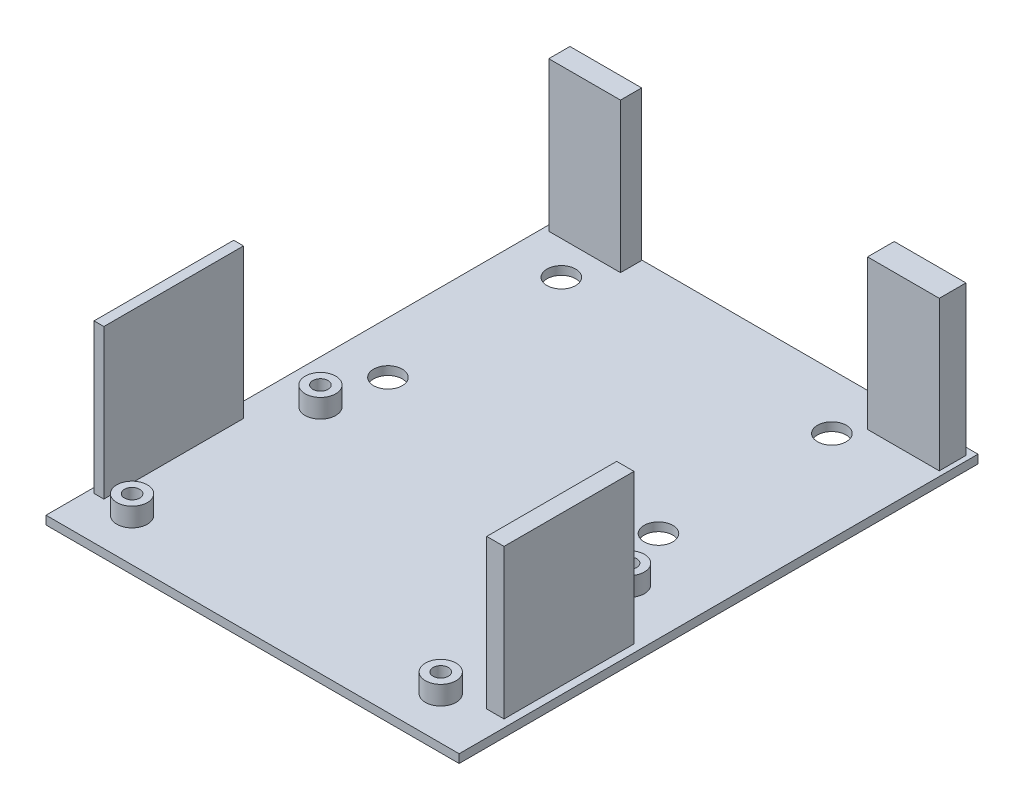
ISO-10303-21;
HEADER;
FILE_DESCRIPTION(('STEP AP214'),'2;1');
FILE_NAME('part.step','',(''),(''),'','','');
FILE_SCHEMA(('AUTOMOTIVE_DESIGN { 1 0 10303 214 1 1 1 1 }'));
ENDSEC;
DATA;
#1=APPLICATION_CONTEXT('core data for automotive mechanical design processes');
#2=APPLICATION_PROTOCOL_DEFINITION('international standard','automotive_design',2000,#1);
#3=PRODUCT_CONTEXT('',#1,'mechanical');
#4=PRODUCT('Part','Part','',(#3));
#5=PRODUCT_RELATED_PRODUCT_CATEGORY('part','',(#4));
#6=PRODUCT_DEFINITION_FORMATION('','',#4);
#7=PRODUCT_DEFINITION_CONTEXT('part definition',#1,'design');
#8=PRODUCT_DEFINITION('design','',#6,#7);
#9=PRODUCT_DEFINITION_SHAPE('','',#8);
#10=(LENGTH_UNIT() NAMED_UNIT(*) SI_UNIT(.MILLI.,.METRE.));
#11=(NAMED_UNIT(*) PLANE_ANGLE_UNIT() SI_UNIT($,.RADIAN.));
#12=(NAMED_UNIT(*) SI_UNIT($,.STERADIAN.) SOLID_ANGLE_UNIT());
#13=UNCERTAINTY_MEASURE_WITH_UNIT(LENGTH_MEASURE(1.E-05),#10,'distance_accuracy_value','');
#14=(GEOMETRIC_REPRESENTATION_CONTEXT(3) GLOBAL_UNCERTAINTY_ASSIGNED_CONTEXT((#13)) GLOBAL_UNIT_ASSIGNED_CONTEXT((#10,
#11,#12)) REPRESENTATION_CONTEXT('',''));
#15=CARTESIAN_POINT('',(0.,0.,0.));
#16=DIRECTION('',(0.,0.,1.));
#17=DIRECTION('',(1.,0.,0.));
#18=AXIS2_PLACEMENT_3D('',#15,#16,#17);
#19=CARTESIAN_POINT('',(40.9585387212004,1.778,0.));
#20=DIRECTION('',(1.,0.,0.));
#21=DIRECTION('',(0.,0.,-1.));
#22=AXIS2_PLACEMENT_3D('',#19,#20,#21);
#23=PLANE('',#22);
#24=DIRECTION('',(0.,0.,1.));
#25=VECTOR('',#24,1.);
#26=CARTESIAN_POINT('',(40.9585387212004,0.,0.));
#27=LINE('',#26,#25);
#28=CARTESIAN_POINT('',(40.9585387212004,0.,-82.3503703778729));
#29=VERTEX_POINT('',#28);
#30=CARTESIAN_POINT('',(40.9585387212004,0.,26.1076296221271));
#31=VERTEX_POINT('',#30);
#32=EDGE_CURVE('E425',#29,#31,#27,.T.);
#33=ORIENTED_EDGE('',*,*,#32,.F.);
#34=DIRECTION('',(0.,-1.,0.));
#35=VECTOR('',#34,1.);
#36=CARTESIAN_POINT('',(40.9585387212004,1.778,-82.3503703778729));
#37=LINE('',#36,#35);
#38=CARTESIAN_POINT('',(40.9585387212004,1.778,-82.3503703778729));
#39=VERTEX_POINT('',#38);
#40=EDGE_CURVE('E11',#39,#29,#37,.T.);
#41=ORIENTED_EDGE('',*,*,#40,.F.);
#42=DIRECTION('',(0.,0.,1.));
#43=VECTOR('',#42,1.);
#44=CARTESIAN_POINT('',(40.9585387212004,1.778,0.));
#45=LINE('',#44,#43);
#46=CARTESIAN_POINT('',(40.9585387212004,1.778,26.1076296221271));
#47=VERTEX_POINT('',#46);
#48=EDGE_CURVE('E348',#39,#47,#45,.T.);
#49=ORIENTED_EDGE('',*,*,#48,.T.);
#50=DIRECTION('',(0.,-1.,0.));
#51=VECTOR('',#50,1.);
#52=CARTESIAN_POINT('',(40.9585387212004,1.778,26.1076296221271));
#53=LINE('',#52,#51);
#54=EDGE_CURVE('E90',#47,#31,#53,.T.);
#55=ORIENTED_EDGE('',*,*,#54,.T.);
#56=EDGE_LOOP('',(#33,#41,#49,#55));
#57=FACE_BOUND('',#56,.T.);
#58=ADVANCED_FACE('F47',(#57),#23,.T.);
#59=CARTESIAN_POINT('',(0.,1.778,-82.3503703778729));
#60=DIRECTION('',(0.,0.,-1.));
#61=DIRECTION('',(-1.,0.,0.));
#62=AXIS2_PLACEMENT_3D('',#59,#60,#61);
#63=PLANE('',#62);
#64=DIRECTION('',(1.,0.,0.));
#65=VECTOR('',#64,1.);
#66=CARTESIAN_POINT('',(0.,0.,-82.3503703778729));
#67=LINE('',#66,#65);
#68=CARTESIAN_POINT('',(-45.4014612787996,0.,-82.3503703778729));
#69=VERTEX_POINT('',#68);
#70=EDGE_CURVE('E428',#69,#29,#67,.T.);
#71=ORIENTED_EDGE('',*,*,#70,.F.);
#72=DIRECTION('',(0.,-1.,0.));
#73=VECTOR('',#72,1.);
#74=CARTESIAN_POINT('',(-45.4014612787996,1.778,-82.3503703778729));
#75=LINE('',#74,#73);
#76=CARTESIAN_POINT('',(-45.4014612787996,1.778,-82.3503703778729));
#77=VERTEX_POINT('',#76);
#78=EDGE_CURVE('E57',#77,#69,#75,.T.);
#79=ORIENTED_EDGE('',*,*,#78,.F.);
#80=DIRECTION('',(1.,0.,0.));
#81=VECTOR('',#80,1.);
#82=CARTESIAN_POINT('',(0.,1.778,-82.3503703778729));
#83=LINE('',#82,#81);
#84=EDGE_CURVE('E351',#77,#39,#83,.T.);
#85=ORIENTED_EDGE('',*,*,#84,.T.);
#86=ORIENTED_EDGE('',*,*,#40,.T.);
#87=EDGE_LOOP('',(#71,#79,#85,#86));
#88=FACE_BOUND('',#87,.T.);
#89=ADVANCED_FACE('F452',(#88),#63,.T.);
#90=CARTESIAN_POINT('',(-45.4014612787996,1.778,0.));
#91=DIRECTION('',(1.,0.,0.));
#92=DIRECTION('',(0.,0.,-1.));
#93=AXIS2_PLACEMENT_3D('',#90,#91,#92);
#94=PLANE('',#93);
#95=DIRECTION('',(0.,0.,1.));
#96=VECTOR('',#95,1.);
#97=CARTESIAN_POINT('',(-45.4014612787996,0.,0.));
#98=LINE('',#97,#96);
#99=CARTESIAN_POINT('',(-45.4014612787996,0.,26.1076296221271));
#100=VERTEX_POINT('',#99);
#101=EDGE_CURVE('E432',#69,#100,#98,.T.);
#102=ORIENTED_EDGE('',*,*,#101,.T.);
#103=DIRECTION('',(0.,-1.,0.));
#104=VECTOR('',#103,1.);
#105=CARTESIAN_POINT('',(-45.4014612787996,1.778,26.1076296221271));
#106=LINE('',#105,#104);
#107=CARTESIAN_POINT('',(-45.4014612787996,1.778,26.1076296221271));
#108=VERTEX_POINT('',#107);
#109=EDGE_CURVE('E440',#108,#100,#106,.T.);
#110=ORIENTED_EDGE('',*,*,#109,.F.);
#111=DIRECTION('',(0.,0.,1.));
#112=VECTOR('',#111,1.);
#113=CARTESIAN_POINT('',(-45.4014612787996,1.778,0.));
#114=LINE('',#113,#112);
#115=EDGE_CURVE('E355',#77,#108,#114,.T.);
#116=ORIENTED_EDGE('',*,*,#115,.F.);
#117=ORIENTED_EDGE('',*,*,#78,.T.);
#118=EDGE_LOOP('',(#102,#110,#116,#117));
#119=FACE_BOUND('',#118,.T.);
#120=ADVANCED_FACE('F445',(#119),#94,.F.);
#121=CARTESIAN_POINT('',(0.,1.778,26.1076296221271));
#122=DIRECTION('',(0.,0.,-1.));
#123=DIRECTION('',(-1.,0.,0.));
#124=AXIS2_PLACEMENT_3D('',#121,#122,#123);
#125=PLANE('',#124);
#126=DIRECTION('',(1.,0.,0.));
#127=VECTOR('',#126,1.);
#128=CARTESIAN_POINT('',(0.,0.,26.1076296221271));
#129=LINE('',#128,#127);
#130=EDGE_CURVE('E82',#100,#31,#129,.T.);
#131=ORIENTED_EDGE('',*,*,#130,.T.);
#132=ORIENTED_EDGE('',*,*,#54,.F.);
#133=DIRECTION('',(1.,0.,0.));
#134=VECTOR('',#133,1.);
#135=CARTESIAN_POINT('',(0.,1.778,26.1076296221271));
#136=LINE('',#135,#134);
#137=EDGE_CURVE('E359',#108,#47,#136,.T.);
#138=ORIENTED_EDGE('',*,*,#137,.F.);
#139=ORIENTED_EDGE('',*,*,#109,.T.);
#140=EDGE_LOOP('',(#131,#132,#138,#139));
#141=FACE_BOUND('',#140,.T.);
#142=ADVANCED_FACE('F465',(#141),#125,.F.);
#143=CARTESIAN_POINT('',(-34.6100551644093,1.778,-70.8225192664491));
#144=DIRECTION('',(0.,-1.,0.));
#145=DIRECTION('',(0.,0.,-1.));
#146=AXIS2_PLACEMENT_3D('',#143,#144,#145);
#147=CYLINDRICAL_SURFACE('',#146,3.);
#148=CARTESIAN_POINT('',(-34.6100551644093,1.778,-70.8225192664491));
#149=DIRECTION('',(0.,1.,0.));
#150=DIRECTION('',(0.,0.,1.));
#151=AXIS2_PLACEMENT_3D('',#148,#149,#150);
#152=CIRCLE('',#151,3.);
#153=CARTESIAN_POINT('',(-34.6100551644093,1.778,-67.822519266449));
#154=VERTEX_POINT('',#153);
#155=EDGE_CURVE('E344',#154,#154,#152,.T.);
#156=ORIENTED_EDGE('',*,*,#155,.T.);
#157=EDGE_LOOP('',(#156));
#158=FACE_BOUND('',#157,.T.);
#159=CARTESIAN_POINT('',(-34.6100551644093,0.,-70.8225192664491));
#160=DIRECTION('',(0.,1.,0.));
#161=DIRECTION('',(0.,0.,1.));
#162=AXIS2_PLACEMENT_3D('',#159,#160,#161);
#163=CIRCLE('',#162,3.);
#164=CARTESIAN_POINT('',(-34.6100551644093,0.,-67.822519266449));
#165=VERTEX_POINT('',#164);
#166=EDGE_CURVE('E421',#165,#165,#163,.T.);
#167=ORIENTED_EDGE('',*,*,#166,.F.);
#168=EDGE_LOOP('',(#167));
#169=FACE_BOUND('',#168,.T.);
#170=ADVANCED_FACE('F461',(#158,#169),#147,.F.);
#171=CARTESIAN_POINT('',(21.9430448355907,1.778,-70.8225192664491));
#172=DIRECTION('',(0.,-1.,0.));
#173=DIRECTION('',(0.,0.,-1.));
#174=AXIS2_PLACEMENT_3D('',#171,#172,#173);
#175=CYLINDRICAL_SURFACE('',#174,3.);
#176=CARTESIAN_POINT('',(21.9430448355907,1.778,-70.8225192664491));
#177=DIRECTION('',(0.,1.,0.));
#178=DIRECTION('',(0.,0.,1.));
#179=AXIS2_PLACEMENT_3D('',#176,#177,#178);
#180=CIRCLE('',#179,3.);
#181=CARTESIAN_POINT('',(21.9430448355907,1.778,-67.822519266449));
#182=VERTEX_POINT('',#181);
#183=EDGE_CURVE('E340',#182,#182,#180,.T.);
#184=ORIENTED_EDGE('',*,*,#183,.T.);
#185=EDGE_LOOP('',(#184));
#186=FACE_BOUND('',#185,.T.);
#187=CARTESIAN_POINT('',(21.9430448355907,0.,-70.8225192664491));
#188=DIRECTION('',(0.,1.,0.));
#189=DIRECTION('',(0.,0.,1.));
#190=AXIS2_PLACEMENT_3D('',#187,#188,#189);
#191=CIRCLE('',#190,3.);
#192=CARTESIAN_POINT('',(21.9430448355907,0.,-67.822519266449));
#193=VERTEX_POINT('',#192);
#194=EDGE_CURVE('E417',#193,#193,#191,.T.);
#195=ORIENTED_EDGE('',*,*,#194,.F.);
#196=EDGE_LOOP('',(#195));
#197=FACE_BOUND('',#196,.T.);
#198=ADVANCED_FACE('F464',(#186,#197),#175,.F.);
#199=CARTESIAN_POINT('',(-34.6100551644093,1.778,-34.5767192664491));
#200=DIRECTION('',(0.,-1.,0.));
#201=DIRECTION('',(0.,0.,-1.));
#202=AXIS2_PLACEMENT_3D('',#199,#200,#201);
#203=CYLINDRICAL_SURFACE('',#202,3.);
#204=CARTESIAN_POINT('',(-34.6100551644093,1.778,-34.5767192664491));
#205=DIRECTION('',(0.,1.,0.));
#206=DIRECTION('',(0.,0.,1.));
#207=AXIS2_PLACEMENT_3D('',#204,#205,#206);
#208=CIRCLE('',#207,3.);
#209=CARTESIAN_POINT('',(-34.6100551644093,1.778,-31.5767192664491));
#210=VERTEX_POINT('',#209);
#211=EDGE_CURVE('E336',#210,#210,#208,.T.);
#212=ORIENTED_EDGE('',*,*,#211,.T.);
#213=EDGE_LOOP('',(#212));
#214=FACE_BOUND('',#213,.T.);
#215=CARTESIAN_POINT('',(-34.6100551644093,0.,-34.5767192664491));
#216=DIRECTION('',(0.,1.,0.));
#217=DIRECTION('',(0.,0.,1.));
#218=AXIS2_PLACEMENT_3D('',#215,#216,#217);
#219=CIRCLE('',#218,3.);
#220=CARTESIAN_POINT('',(-34.6100551644093,0.,-31.5767192664491));
#221=VERTEX_POINT('',#220);
#222=EDGE_CURVE('E413',#221,#221,#219,.T.);
#223=ORIENTED_EDGE('',*,*,#222,.F.);
#224=EDGE_LOOP('',(#223));
#225=FACE_BOUND('',#224,.T.);
#226=ADVANCED_FACE('F468',(#214,#225),#203,.F.);
#227=CARTESIAN_POINT('',(21.9430448355907,1.778,-34.5767192664491));
#228=DIRECTION('',(0.,-1.,0.));
#229=DIRECTION('',(0.,0.,-1.));
#230=AXIS2_PLACEMENT_3D('',#227,#228,#229);
#231=CYLINDRICAL_SURFACE('',#230,3.);
#232=CARTESIAN_POINT('',(21.9430448355907,1.778,-34.5767192664491));
#233=DIRECTION('',(0.,1.,0.));
#234=DIRECTION('',(0.,0.,1.));
#235=AXIS2_PLACEMENT_3D('',#232,#233,#234);
#236=CIRCLE('',#235,3.);
#237=CARTESIAN_POINT('',(21.9430448355907,1.778,-31.5767192664491));
#238=VERTEX_POINT('',#237);
#239=EDGE_CURVE('E332',#238,#238,#236,.T.);
#240=ORIENTED_EDGE('',*,*,#239,.T.);
#241=EDGE_LOOP('',(#240));
#242=FACE_BOUND('',#241,.T.);
#243=CARTESIAN_POINT('',(21.9430448355907,0.,-34.5767192664491));
#244=DIRECTION('',(0.,1.,0.));
#245=DIRECTION('',(0.,0.,1.));
#246=AXIS2_PLACEMENT_3D('',#243,#244,#245);
#247=CIRCLE('',#246,3.);
#248=CARTESIAN_POINT('',(21.9430448355907,0.,-31.5767192664491));
#249=VERTEX_POINT('',#248);
#250=EDGE_CURVE('E312',#249,#249,#247,.T.);
#251=ORIENTED_EDGE('',*,*,#250,.F.);
#252=EDGE_LOOP('',(#251));
#253=FACE_BOUND('',#252,.T.);
#254=ADVANCED_FACE('F49',(#242,#253),#231,.F.);
#255=CARTESIAN_POINT('',(0.,1.778,0.));
#256=DIRECTION('',(0.,1.,0.));
#257=DIRECTION('',(0.,0.,1.));
#258=AXIS2_PLACEMENT_3D('',#255,#256,#257);
#259=PLANE('',#258);
#260=CARTESIAN_POINT('',(28.1534381304671,1.778,17.1504808356986));
#261=DIRECTION('',(0.,1.,0.));
#262=DIRECTION('',(0.,0.,1.));
#263=AXIS2_PLACEMENT_3D('',#260,#261,#262);
#264=CIRCLE('',#263,3.2);
#265=CARTESIAN_POINT('',(28.1534381304671,1.778,20.3504808356986));
#266=VERTEX_POINT('',#265);
#267=EDGE_CURVE('E316',#266,#266,#264,.T.);
#268=ORIENTED_EDGE('',*,*,#267,.F.);
#269=EDGE_LOOP('',(#268));
#270=FACE_BOUND('',#269,.T.);
#271=CARTESIAN_POINT('',(-36.3625618695329,1.778,17.1504808356986));
#272=DIRECTION('',(0.,1.,0.));
#273=DIRECTION('',(0.,0.,1.));
#274=AXIS2_PLACEMENT_3D('',#271,#272,#273);
#275=CIRCLE('',#274,3.2);
#276=CARTESIAN_POINT('',(-36.3625618695329,1.778,20.3504808356986));
#277=VERTEX_POINT('',#276);
#278=EDGE_CURVE('E320',#277,#277,#275,.T.);
#279=ORIENTED_EDGE('',*,*,#278,.F.);
#280=EDGE_LOOP('',(#279));
#281=FACE_BOUND('',#280,.T.);
#282=CARTESIAN_POINT('',(28.1534381304671,1.778,-22.2195191643014));
#283=DIRECTION('',(0.,1.,0.));
#284=DIRECTION('',(0.,0.,1.));
#285=AXIS2_PLACEMENT_3D('',#282,#283,#284);
#286=CIRCLE('',#285,3.2);
#287=CARTESIAN_POINT('',(28.1534381304671,1.778,-19.0195191643014));
#288=VERTEX_POINT('',#287);
#289=EDGE_CURVE('E324',#288,#288,#286,.T.);
#290=ORIENTED_EDGE('',*,*,#289,.F.);
#291=EDGE_LOOP('',(#290));
#292=FACE_BOUND('',#291,.T.);
#293=CARTESIAN_POINT('',(-36.3625618695329,1.778,-22.2195191643014));
#294=DIRECTION('',(0.,1.,0.));
#295=DIRECTION('',(0.,0.,1.));
#296=AXIS2_PLACEMENT_3D('',#293,#294,#295);
#297=CIRCLE('',#296,3.2);
#298=CARTESIAN_POINT('',(-36.3625618695329,1.778,-19.0195191643014));
#299=VERTEX_POINT('',#298);
#300=EDGE_CURVE('E328',#299,#299,#297,.T.);
#301=ORIENTED_EDGE('',*,*,#300,.F.);
#302=EDGE_LOOP('',(#301));
#303=FACE_BOUND('',#302,.T.);
#304=ORIENTED_EDGE('',*,*,#239,.F.);
#305=EDGE_LOOP('',(#304));
#306=FACE_BOUND('',#305,.T.);
#307=ORIENTED_EDGE('',*,*,#211,.F.);
#308=EDGE_LOOP('',(#307));
#309=FACE_BOUND('',#308,.T.);
#310=ORIENTED_EDGE('',*,*,#183,.F.);
#311=EDGE_LOOP('',(#310));
#312=FACE_BOUND('',#311,.T.);
#313=ORIENTED_EDGE('',*,*,#155,.F.);
#314=EDGE_LOOP('',(#313));
#315=FACE_BOUND('',#314,.T.);
#316=ORIENTED_EDGE('',*,*,#48,.F.);
#317=ORIENTED_EDGE('',*,*,#84,.F.);
#318=ORIENTED_EDGE('',*,*,#115,.T.);
#319=ORIENTED_EDGE('',*,*,#137,.T.);
#320=EDGE_LOOP('',(#316,#317,#318,#319));
#321=FACE_BOUND('',#320,.T.);
#322=DIRECTION('',(1.,0.,0.));
#323=VECTOR('',#322,1.);
#324=CARTESIAN_POINT('',(0.,1.778,-82.2619916514084));
#325=LINE('',#324,#323);
#326=CARTESIAN_POINT('',(-44.2528565853673,1.778,-82.2619916514084));
#327=VERTEX_POINT('',#326);
#328=CARTESIAN_POINT('',(-29.2592550624016,1.778,-82.2619916514084));
#329=VERTEX_POINT('',#328);
#330=EDGE_CURVE('E362',#327,#329,#325,.T.);
#331=ORIENTED_EDGE('',*,*,#330,.T.);
#332=DIRECTION('',(0.,0.,1.));
#333=VECTOR('',#332,1.);
#334=CARTESIAN_POINT('',(-29.2592550624016,1.778,0.));
#335=LINE('',#334,#333);
#336=CARTESIAN_POINT('',(-29.2592550624016,1.778,-77.8401570510367));
#337=VERTEX_POINT('',#336);
#338=EDGE_CURVE('E365',#329,#337,#335,.T.);
#339=ORIENTED_EDGE('',*,*,#338,.T.);
#340=DIRECTION('',(1.,0.,0.));
#341=VECTOR('',#340,1.);
#342=CARTESIAN_POINT('',(0.,1.778,-77.8401570510367));
#343=LINE('',#342,#341);
#344=CARTESIAN_POINT('',(-44.2528565853673,1.778,-77.8401570510367));
#345=VERTEX_POINT('',#344);
#346=EDGE_CURVE('E369',#345,#337,#343,.T.);
#347=ORIENTED_EDGE('',*,*,#346,.F.);
#348=DIRECTION('',(0.,0.,1.));
#349=VECTOR('',#348,1.);
#350=CARTESIAN_POINT('',(-44.2528565853673,1.778,0.));
#351=LINE('',#350,#349);
#352=EDGE_CURVE('E373',#327,#345,#351,.T.);
#353=ORIENTED_EDGE('',*,*,#352,.F.);
#354=EDGE_LOOP('',(#331,#339,#347,#353));
#355=FACE_BOUND('',#354,.T.);
#356=DIRECTION('',(1.,0.,0.));
#357=VECTOR('',#356,1.);
#358=CARTESIAN_POINT('',(0.,1.778,-80.8514753160351));
#359=LINE('',#358,#357);
#360=CARTESIAN_POINT('',(24.9444737075684,1.778,-80.8514753160351));
#361=VERTEX_POINT('',#360);
#362=CARTESIAN_POINT('',(39.9380105814928,1.778,-80.8514753160351));
#363=VERTEX_POINT('',#362);
#364=EDGE_CURVE('E377',#361,#363,#359,.T.);
#365=ORIENTED_EDGE('',*,*,#364,.T.);
#366=DIRECTION('',(0.,0.,1.));
#367=VECTOR('',#366,1.);
#368=CARTESIAN_POINT('',(39.9380105814928,1.778,0.));
#369=LINE('',#368,#367);
#370=CARTESIAN_POINT('',(39.9380105814928,1.778,-75.277332995719));
#371=VERTEX_POINT('',#370);
#372=EDGE_CURVE('E380',#363,#371,#369,.T.);
#373=ORIENTED_EDGE('',*,*,#372,.T.);
#374=DIRECTION('',(1.,0.,0.));
#375=VECTOR('',#374,1.);
#376=CARTESIAN_POINT('',(0.,1.778,-75.277332995719));
#377=LINE('',#376,#375);
#378=CARTESIAN_POINT('',(24.9444737075684,1.778,-75.277332995719));
#379=VERTEX_POINT('',#378);
#380=EDGE_CURVE('E384',#379,#371,#377,.T.);
#381=ORIENTED_EDGE('',*,*,#380,.F.);
#382=DIRECTION('',(0.,0.,1.));
#383=VECTOR('',#382,1.);
#384=CARTESIAN_POINT('',(24.9444737075684,1.778,0.));
#385=LINE('',#384,#383);
#386=EDGE_CURVE('E388',#361,#379,#385,.T.);
#387=ORIENTED_EDGE('',*,*,#386,.F.);
#388=EDGE_LOOP('',(#365,#373,#381,#387));
#389=FACE_BOUND('',#388,.T.);
#390=DIRECTION('',(1.,0.,0.));
#391=VECTOR('',#390,1.);
#392=CARTESIAN_POINT('',(0.,1.778,-12.0392068334715));
#393=LINE('',#392,#391);
#394=CARTESIAN_POINT('',(35.7413604970602,1.778,-12.0392068334715));
#395=VERTEX_POINT('',#394);
#396=CARTESIAN_POINT('',(39.361443133423,1.778,-12.0392068334715));
#397=VERTEX_POINT('',#396);
#398=EDGE_CURVE('E392',#395,#397,#393,.T.);
#399=ORIENTED_EDGE('',*,*,#398,.T.);
#400=DIRECTION('',(0.,0.,1.));
#401=VECTOR('',#400,1.);
#402=CARTESIAN_POINT('',(39.361443133423,1.778,0.));
#403=LINE('',#402,#401);
#404=CARTESIAN_POINT('',(39.361443133423,1.778,15.127431004012));
#405=VERTEX_POINT('',#404);
#406=EDGE_CURVE('E395',#397,#405,#403,.T.);
#407=ORIENTED_EDGE('',*,*,#406,.T.);
#408=DIRECTION('',(1.,0.,0.));
#409=VECTOR('',#408,1.);
#410=CARTESIAN_POINT('',(0.,1.778,15.127431004012));
#411=LINE('',#410,#409);
#412=CARTESIAN_POINT('',(35.7413604970602,1.778,15.127431004012));
#413=VERTEX_POINT('',#412);
#414=EDGE_CURVE('E399',#413,#405,#411,.T.);
#415=ORIENTED_EDGE('',*,*,#414,.F.);
#416=DIRECTION('',(0.,0.,1.));
#417=VECTOR('',#416,1.);
#418=CARTESIAN_POINT('',(35.7413604970602,1.778,0.));
#419=LINE('',#418,#417);
#420=EDGE_CURVE('E144',#395,#413,#419,.T.);
#421=ORIENTED_EDGE('',*,*,#420,.F.);
#422=EDGE_LOOP('',(#399,#407,#415,#421));
#423=FACE_BOUND('',#422,.T.);
#424=DIRECTION('',(1.,0.,0.));
#425=VECTOR('',#424,1.);
#426=CARTESIAN_POINT('',(0.,1.778,-12.0392068334715));
#427=LINE('',#426,#425);
#428=CARTESIAN_POINT('',(-44.3169271867502,1.778,-12.0392068334715));
#429=VERTEX_POINT('',#428);
#430=CARTESIAN_POINT('',(-42.2666148971288,1.778,-12.0392068334715));
#431=VERTEX_POINT('',#430);
#432=EDGE_CURVE('E133',#429,#431,#427,.T.);
#433=ORIENTED_EDGE('',*,*,#432,.T.);
#434=DIRECTION('',(0.,0.,1.));
#435=VECTOR('',#434,1.);
#436=CARTESIAN_POINT('',(-42.2666148971288,1.778,0.));
#437=LINE('',#436,#435);
#438=CARTESIAN_POINT('',(-42.2666148971288,1.778,17.1504808356986));
#439=VERTEX_POINT('',#438);
#440=EDGE_CURVE('E137',#431,#439,#437,.T.);
#441=ORIENTED_EDGE('',*,*,#440,.T.);
#442=DIRECTION('',(1.,0.,0.));
#443=VECTOR('',#442,1.);
#444=CARTESIAN_POINT('',(0.,1.778,17.1504808356986));
#445=LINE('',#444,#443);
#446=CARTESIAN_POINT('',(-44.3169271867502,1.778,17.1504808356986));
#447=VERTEX_POINT('',#446);
#448=EDGE_CURVE('E157',#447,#439,#445,.T.);
#449=ORIENTED_EDGE('',*,*,#448,.F.);
#450=DIRECTION('',(0.,0.,1.));
#451=VECTOR('',#450,1.);
#452=CARTESIAN_POINT('',(-44.3169271867502,1.778,0.));
#453=LINE('',#452,#451);
#454=EDGE_CURVE('E65',#429,#447,#453,.T.);
#455=ORIENTED_EDGE('',*,*,#454,.F.);
#456=EDGE_LOOP('',(#433,#441,#449,#455));
#457=FACE_BOUND('',#456,.T.);
#458=ADVANCED_FACE('F135',(#270,#281,#292,#303,#306,#309,#312,#315,#321,#355,#389,#423,#457),
#259,.T.);
#459=CARTESIAN_POINT('',(0.,0.,0.));
#460=DIRECTION('',(0.,1.,0.));
#461=DIRECTION('',(0.,0.,1.));
#462=AXIS2_PLACEMENT_3D('',#459,#460,#461);
#463=PLANE('',#462);
#464=ORIENTED_EDGE('',*,*,#250,.T.);
#465=EDGE_LOOP('',(#464));
#466=FACE_BOUND('',#465,.T.);
#467=ORIENTED_EDGE('',*,*,#222,.T.);
#468=EDGE_LOOP('',(#467));
#469=FACE_BOUND('',#468,.T.);
#470=ORIENTED_EDGE('',*,*,#194,.T.);
#471=EDGE_LOOP('',(#470));
#472=FACE_BOUND('',#471,.T.);
#473=ORIENTED_EDGE('',*,*,#166,.T.);
#474=EDGE_LOOP('',(#473));
#475=FACE_BOUND('',#474,.T.);
#476=ORIENTED_EDGE('',*,*,#32,.T.);
#477=ORIENTED_EDGE('',*,*,#130,.F.);
#478=ORIENTED_EDGE('',*,*,#101,.F.);
#479=ORIENTED_EDGE('',*,*,#70,.T.);
#480=EDGE_LOOP('',(#476,#477,#478,#479));
#481=FACE_BOUND('',#480,.T.);
#482=CARTESIAN_POINT('',(-36.3625618695329,0.,17.1504808356986));
#483=DIRECTION('',(0.,1.,0.));
#484=DIRECTION('',(0.,0.,1.));
#485=AXIS2_PLACEMENT_3D('',#482,#483,#484);
#486=CIRCLE('',#485,1.6);
#487=CARTESIAN_POINT('',(-36.3625618695329,0.,18.7504808356986));
#488=VERTEX_POINT('',#487);
#489=EDGE_CURVE('E300',#488,#488,#486,.T.);
#490=ORIENTED_EDGE('',*,*,#489,.T.);
#491=EDGE_LOOP('',(#490));
#492=FACE_BOUND('',#491,.T.);
#493=CARTESIAN_POINT('',(28.1534381304671,0.,17.1504808356986));
#494=DIRECTION('',(0.,1.,0.));
#495=DIRECTION('',(0.,0.,1.));
#496=AXIS2_PLACEMENT_3D('',#493,#494,#495);
#497=CIRCLE('',#496,1.6);
#498=CARTESIAN_POINT('',(28.1534381304671,0.,18.7504808356986));
#499=VERTEX_POINT('',#498);
#500=EDGE_CURVE('E288',#499,#499,#497,.T.);
#501=ORIENTED_EDGE('',*,*,#500,.T.);
#502=EDGE_LOOP('',(#501));
#503=FACE_BOUND('',#502,.T.);
#504=CARTESIAN_POINT('',(28.1534381304671,0.,-22.2195191643014));
#505=DIRECTION('',(0.,1.,0.));
#506=DIRECTION('',(0.,0.,1.));
#507=AXIS2_PLACEMENT_3D('',#504,#505,#506);
#508=CIRCLE('',#507,1.6);
#509=CARTESIAN_POINT('',(28.1534381304671,0.,-20.6195191643014));
#510=VERTEX_POINT('',#509);
#511=EDGE_CURVE('E276',#510,#510,#508,.T.);
#512=ORIENTED_EDGE('',*,*,#511,.T.);
#513=EDGE_LOOP('',(#512));
#514=FACE_BOUND('',#513,.T.);
#515=CARTESIAN_POINT('',(-36.3625618695329,0.,-22.2195191643014));
#516=DIRECTION('',(0.,1.,0.));
#517=DIRECTION('',(0.,0.,1.));
#518=AXIS2_PLACEMENT_3D('',#515,#516,#517);
#519=CIRCLE('',#518,1.6);
#520=CARTESIAN_POINT('',(-36.3625618695329,0.,-20.6195191643014));
#521=VERTEX_POINT('',#520);
#522=EDGE_CURVE('E267',#521,#521,#519,.T.);
#523=ORIENTED_EDGE('',*,*,#522,.T.);
#524=EDGE_LOOP('',(#523));
#525=FACE_BOUND('',#524,.T.);
#526=ADVANCED_FACE('F450',(#466,#469,#472,#475,#481,#492,#503,#514,#525),#463,.F.);
#527=CARTESIAN_POINT('',(-36.3625618695329,5.715,17.1504808356986));
#528=DIRECTION('',(0.,-1.,0.));
#529=DIRECTION('',(0.,0.,-1.));
#530=AXIS2_PLACEMENT_3D('',#527,#528,#529);
#531=CYLINDRICAL_SURFACE('',#530,1.6);
#532=CARTESIAN_POINT('',(-36.3625618695329,5.715,17.1504808356986));
#533=DIRECTION('',(0.,1.,0.));
#534=DIRECTION('',(0.,0.,1.));
#535=AXIS2_PLACEMENT_3D('',#532,#533,#534);
#536=CIRCLE('',#535,1.6);
#537=CARTESIAN_POINT('',(-36.3625618695329,5.715,18.7504808356986));
#538=VERTEX_POINT('',#537);
#539=EDGE_CURVE('E304',#538,#538,#536,.T.);
#540=ORIENTED_EDGE('',*,*,#539,.T.);
#541=EDGE_LOOP('',(#540));
#542=FACE_BOUND('',#541,.T.);
#543=ORIENTED_EDGE('',*,*,#489,.F.);
#544=EDGE_LOOP('',(#543));
#545=FACE_BOUND('',#544,.T.);
#546=ADVANCED_FACE('F482',(#542,#545),#531,.F.);
#547=CARTESIAN_POINT('',(-36.3625618695329,5.715,17.1504808356986));
#548=DIRECTION('',(0.,-1.,0.));
#549=DIRECTION('',(0.,0.,-1.));
#550=AXIS2_PLACEMENT_3D('',#547,#548,#549);
#551=CYLINDRICAL_SURFACE('',#550,3.2);
#552=ORIENTED_EDGE('',*,*,#278,.T.);
#553=EDGE_LOOP('',(#552));
#554=FACE_BOUND('',#553,.T.);
#555=CARTESIAN_POINT('',(-36.3625618695329,5.715,17.1504808356986));
#556=DIRECTION('',(0.,1.,0.));
#557=DIRECTION('',(0.,0.,1.));
#558=AXIS2_PLACEMENT_3D('',#555,#556,#557);
#559=CIRCLE('',#558,3.2);
#560=CARTESIAN_POINT('',(-36.3625618695329,5.715,20.3504808356986));
#561=VERTEX_POINT('',#560);
#562=EDGE_CURVE('E308',#561,#561,#559,.T.);
#563=ORIENTED_EDGE('',*,*,#562,.F.);
#564=EDGE_LOOP('',(#563));
#565=FACE_BOUND('',#564,.T.);
#566=ADVANCED_FACE('F495',(#554,#565),#551,.T.);
#567=CARTESIAN_POINT('',(0.,5.715,0.));
#568=DIRECTION('',(0.,1.,0.));
#569=DIRECTION('',(0.,0.,1.));
#570=AXIS2_PLACEMENT_3D('',#567,#568,#569);
#571=PLANE('',#570);
#572=ORIENTED_EDGE('',*,*,#539,.F.);
#573=EDGE_LOOP('',(#572));
#574=FACE_BOUND('',#573,.T.);
#575=ORIENTED_EDGE('',*,*,#562,.T.);
#576=EDGE_LOOP('',(#575));
#577=FACE_BOUND('',#576,.T.);
#578=ADVANCED_FACE('F578',(#574,#577),#571,.T.);
#579=CARTESIAN_POINT('',(28.1534381304671,5.715,17.1504808356986));
#580=DIRECTION('',(0.,-1.,0.));
#581=DIRECTION('',(0.,0.,-1.));
#582=AXIS2_PLACEMENT_3D('',#579,#580,#581);
#583=CYLINDRICAL_SURFACE('',#582,1.6);
#584=CARTESIAN_POINT('',(28.1534381304671,5.715,17.1504808356986));
#585=DIRECTION('',(0.,1.,0.));
#586=DIRECTION('',(0.,0.,1.));
#587=AXIS2_PLACEMENT_3D('',#584,#585,#586);
#588=CIRCLE('',#587,1.6);
#589=CARTESIAN_POINT('',(28.1534381304671,5.715,18.7504808356986));
#590=VERTEX_POINT('',#589);
#591=EDGE_CURVE('E292',#590,#590,#588,.T.);
#592=ORIENTED_EDGE('',*,*,#591,.T.);
#593=EDGE_LOOP('',(#592));
#594=FACE_BOUND('',#593,.T.);
#595=ORIENTED_EDGE('',*,*,#500,.F.);
#596=EDGE_LOOP('',(#595));
#597=FACE_BOUND('',#596,.T.);
#598=ADVANCED_FACE('F588',(#594,#597),#583,.F.);
#599=CARTESIAN_POINT('',(28.1534381304671,5.715,17.1504808356986));
#600=DIRECTION('',(0.,-1.,0.));
#601=DIRECTION('',(0.,0.,-1.));
#602=AXIS2_PLACEMENT_3D('',#599,#600,#601);
#603=CYLINDRICAL_SURFACE('',#602,3.2);
#604=ORIENTED_EDGE('',*,*,#267,.T.);
#605=EDGE_LOOP('',(#604));
#606=FACE_BOUND('',#605,.T.);
#607=CARTESIAN_POINT('',(28.1534381304671,5.715,17.1504808356986));
#608=DIRECTION('',(0.,1.,0.));
#609=DIRECTION('',(0.,0.,1.));
#610=AXIS2_PLACEMENT_3D('',#607,#608,#609);
#611=CIRCLE('',#610,3.2);
#612=CARTESIAN_POINT('',(28.1534381304671,5.715,20.3504808356986));
#613=VERTEX_POINT('',#612);
#614=EDGE_CURVE('E296',#613,#613,#611,.T.);
#615=ORIENTED_EDGE('',*,*,#614,.F.);
#616=EDGE_LOOP('',(#615));
#617=FACE_BOUND('',#616,.T.);
#618=ADVANCED_FACE('F598',(#606,#617),#603,.T.);
#619=CARTESIAN_POINT('',(0.,5.715,0.));
#620=DIRECTION('',(0.,1.,0.));
#621=DIRECTION('',(0.,0.,1.));
#622=AXIS2_PLACEMENT_3D('',#619,#620,#621);
#623=PLANE('',#622);
#624=ORIENTED_EDGE('',*,*,#591,.F.);
#625=EDGE_LOOP('',(#624));
#626=FACE_BOUND('',#625,.T.);
#627=ORIENTED_EDGE('',*,*,#614,.T.);
#628=EDGE_LOOP('',(#627));
#629=FACE_BOUND('',#628,.T.);
#630=ADVANCED_FACE('F608',(#626,#629),#623,.T.);
#631=CARTESIAN_POINT('',(28.1534381304671,5.715,-22.2195191643014));
#632=DIRECTION('',(0.,-1.,0.));
#633=DIRECTION('',(0.,0.,-1.));
#634=AXIS2_PLACEMENT_3D('',#631,#632,#633);
#635=CYLINDRICAL_SURFACE('',#634,1.6);
#636=CARTESIAN_POINT('',(28.1534381304671,5.715,-22.2195191643014));
#637=DIRECTION('',(0.,1.,0.));
#638=DIRECTION('',(0.,0.,1.));
#639=AXIS2_PLACEMENT_3D('',#636,#637,#638);
#640=CIRCLE('',#639,1.6);
#641=CARTESIAN_POINT('',(28.1534381304671,5.715,-20.6195191643014));
#642=VERTEX_POINT('',#641);
#643=EDGE_CURVE('E280',#642,#642,#640,.T.);
#644=ORIENTED_EDGE('',*,*,#643,.T.);
#645=EDGE_LOOP('',(#644));
#646=FACE_BOUND('',#645,.T.);
#647=ORIENTED_EDGE('',*,*,#511,.F.);
#648=EDGE_LOOP('',(#647));
#649=FACE_BOUND('',#648,.T.);
#650=ADVANCED_FACE('F618',(#646,#649),#635,.F.);
#651=CARTESIAN_POINT('',(28.1534381304671,5.715,-22.2195191643014));
#652=DIRECTION('',(0.,-1.,0.));
#653=DIRECTION('',(0.,0.,-1.));
#654=AXIS2_PLACEMENT_3D('',#651,#652,#653);
#655=CYLINDRICAL_SURFACE('',#654,3.2);
#656=ORIENTED_EDGE('',*,*,#289,.T.);
#657=EDGE_LOOP('',(#656));
#658=FACE_BOUND('',#657,.T.);
#659=CARTESIAN_POINT('',(28.1534381304671,5.715,-22.2195191643014));
#660=DIRECTION('',(0.,1.,0.));
#661=DIRECTION('',(0.,0.,1.));
#662=AXIS2_PLACEMENT_3D('',#659,#660,#661);
#663=CIRCLE('',#662,3.2);
#664=CARTESIAN_POINT('',(28.1534381304671,5.715,-19.0195191643014));
#665=VERTEX_POINT('',#664);
#666=EDGE_CURVE('E284',#665,#665,#663,.T.);
#667=ORIENTED_EDGE('',*,*,#666,.F.);
#668=EDGE_LOOP('',(#667));
#669=FACE_BOUND('',#668,.T.);
#670=ADVANCED_FACE('F628',(#658,#669),#655,.T.);
#671=CARTESIAN_POINT('',(0.,5.715,0.));
#672=DIRECTION('',(0.,1.,0.));
#673=DIRECTION('',(0.,0.,1.));
#674=AXIS2_PLACEMENT_3D('',#671,#672,#673);
#675=PLANE('',#674);
#676=ORIENTED_EDGE('',*,*,#643,.F.);
#677=EDGE_LOOP('',(#676));
#678=FACE_BOUND('',#677,.T.);
#679=ORIENTED_EDGE('',*,*,#666,.T.);
#680=EDGE_LOOP('',(#679));
#681=FACE_BOUND('',#680,.T.);
#682=ADVANCED_FACE('F638',(#678,#681),#675,.T.);
#683=CARTESIAN_POINT('',(-36.3625618695329,5.715,-22.2195191643014));
#684=DIRECTION('',(0.,-1.,0.));
#685=DIRECTION('',(0.,0.,-1.));
#686=AXIS2_PLACEMENT_3D('',#683,#684,#685);
#687=CYLINDRICAL_SURFACE('',#686,1.6);
#688=CARTESIAN_POINT('',(-36.3625618695329,5.715,-22.2195191643014));
#689=DIRECTION('',(0.,1.,0.));
#690=DIRECTION('',(0.,0.,1.));
#691=AXIS2_PLACEMENT_3D('',#688,#689,#690);
#692=CIRCLE('',#691,1.6);
#693=CARTESIAN_POINT('',(-36.3625618695329,5.715,-20.6195191643014));
#694=VERTEX_POINT('',#693);
#695=EDGE_CURVE('E268',#694,#694,#692,.T.);
#696=ORIENTED_EDGE('',*,*,#695,.T.);
#697=EDGE_LOOP('',(#696));
#698=FACE_BOUND('',#697,.T.);
#699=ORIENTED_EDGE('',*,*,#522,.F.);
#700=EDGE_LOOP('',(#699));
#701=FACE_BOUND('',#700,.T.);
#702=ADVANCED_FACE('F648',(#698,#701),#687,.F.);
#703=CARTESIAN_POINT('',(-36.3625618695329,5.715,-22.2195191643014));
#704=DIRECTION('',(0.,-1.,0.));
#705=DIRECTION('',(0.,0.,-1.));
#706=AXIS2_PLACEMENT_3D('',#703,#704,#705);
#707=CYLINDRICAL_SURFACE('',#706,3.2);
#708=ORIENTED_EDGE('',*,*,#300,.T.);
#709=EDGE_LOOP('',(#708));
#710=FACE_BOUND('',#709,.T.);
#711=CARTESIAN_POINT('',(-36.3625618695329,5.715,-22.2195191643014));
#712=DIRECTION('',(0.,1.,0.));
#713=DIRECTION('',(0.,0.,1.));
#714=AXIS2_PLACEMENT_3D('',#711,#712,#713);
#715=CIRCLE('',#714,3.2);
#716=CARTESIAN_POINT('',(-36.3625618695329,5.715,-19.0195191643014));
#717=VERTEX_POINT('',#716);
#718=EDGE_CURVE('E272',#717,#717,#715,.T.);
#719=ORIENTED_EDGE('',*,*,#718,.F.);
#720=EDGE_LOOP('',(#719));
#721=FACE_BOUND('',#720,.T.);
#722=ADVANCED_FACE('F658',(#710,#721),#707,.T.);
#723=CARTESIAN_POINT('',(0.,5.715,0.));
#724=DIRECTION('',(0.,1.,0.));
#725=DIRECTION('',(0.,0.,1.));
#726=AXIS2_PLACEMENT_3D('',#723,#724,#725);
#727=PLANE('',#726);
#728=ORIENTED_EDGE('',*,*,#695,.F.);
#729=EDGE_LOOP('',(#728));
#730=FACE_BOUND('',#729,.T.);
#731=ORIENTED_EDGE('',*,*,#718,.T.);
#732=EDGE_LOOP('',(#731));
#733=FACE_BOUND('',#732,.T.);
#734=ADVANCED_FACE('F667',(#730,#733),#727,.T.);
#735=CARTESIAN_POINT('',(-29.2592550624016,33.02,0.));
#736=DIRECTION('',(1.,0.,0.));
#737=DIRECTION('',(0.,0.,-1.));
#738=AXIS2_PLACEMENT_3D('',#735,#736,#737);
#739=PLANE('',#738);
#740=DIRECTION('',(0.,-1.,0.));
#741=VECTOR('',#740,1.);
#742=CARTESIAN_POINT('',(-29.2592550624016,33.02,-77.8401570510367));
#743=LINE('',#742,#741);
#744=CARTESIAN_POINT('',(-29.2592550624016,33.02,-77.8401570510367));
#745=VERTEX_POINT('',#744);
#746=EDGE_CURVE('E251',#745,#337,#743,.T.);
#747=ORIENTED_EDGE('',*,*,#746,.T.);
#748=ORIENTED_EDGE('',*,*,#338,.F.);
#749=DIRECTION('',(0.,-1.,0.));
#750=VECTOR('',#749,1.);
#751=CARTESIAN_POINT('',(-29.2592550624016,33.02,-82.2619916514084));
#752=LINE('',#751,#750);
#753=CARTESIAN_POINT('',(-29.2592550624016,33.02,-82.2619916514084));
#754=VERTEX_POINT('',#753);
#755=EDGE_CURVE('E263',#754,#329,#752,.T.);
#756=ORIENTED_EDGE('',*,*,#755,.F.);
#757=DIRECTION('',(0.,0.,1.));
#758=VECTOR('',#757,1.);
#759=CARTESIAN_POINT('',(-29.2592550624016,33.02,0.));
#760=LINE('',#759,#758);
#761=EDGE_CURVE('E235',#754,#745,#760,.T.);
#762=ORIENTED_EDGE('',*,*,#761,.T.);
#763=EDGE_LOOP('',(#747,#748,#756,#762));
#764=FACE_BOUND('',#763,.T.);
#765=ADVANCED_FACE('F675',(#764),#739,.T.);
#766=CARTESIAN_POINT('',(0.,33.02,-82.2619916514084));
#767=DIRECTION('',(0.,0.,-1.));
#768=DIRECTION('',(-1.,0.,0.));
#769=AXIS2_PLACEMENT_3D('',#766,#767,#768);
#770=PLANE('',#769);
#771=ORIENTED_EDGE('',*,*,#755,.T.);
#772=ORIENTED_EDGE('',*,*,#330,.F.);
#773=DIRECTION('',(0.,-1.,0.));
#774=VECTOR('',#773,1.);
#775=CARTESIAN_POINT('',(-44.2528565853673,33.02,-82.2619916514084));
#776=LINE('',#775,#774);
#777=CARTESIAN_POINT('',(-44.2528565853673,33.02,-82.2619916514084));
#778=VERTEX_POINT('',#777);
#779=EDGE_CURVE('E259',#778,#327,#776,.T.);
#780=ORIENTED_EDGE('',*,*,#779,.F.);
#781=DIRECTION('',(1.,0.,0.));
#782=VECTOR('',#781,1.);
#783=CARTESIAN_POINT('',(0.,33.02,-82.2619916514084));
#784=LINE('',#783,#782);
#785=EDGE_CURVE('E239',#778,#754,#784,.T.);
#786=ORIENTED_EDGE('',*,*,#785,.T.);
#787=EDGE_LOOP('',(#771,#772,#780,#786));
#788=FACE_BOUND('',#787,.T.);
#789=ADVANCED_FACE('F684',(#788),#770,.T.);
#790=CARTESIAN_POINT('',(-44.2528565853673,33.02,0.));
#791=DIRECTION('',(1.,0.,0.));
#792=DIRECTION('',(0.,0.,-1.));
#793=AXIS2_PLACEMENT_3D('',#790,#791,#792);
#794=PLANE('',#793);
#795=ORIENTED_EDGE('',*,*,#352,.T.);
#796=DIRECTION('',(0.,-1.,0.));
#797=VECTOR('',#796,1.);
#798=CARTESIAN_POINT('',(-44.2528565853673,33.02,-77.8401570510367));
#799=LINE('',#798,#797);
#800=CARTESIAN_POINT('',(-44.2528565853673,33.02,-77.8401570510367));
#801=VERTEX_POINT('',#800);
#802=EDGE_CURVE('E255',#801,#345,#799,.T.);
#803=ORIENTED_EDGE('',*,*,#802,.F.);
#804=DIRECTION('',(0.,0.,1.));
#805=VECTOR('',#804,1.);
#806=CARTESIAN_POINT('',(-44.2528565853673,33.02,0.));
#807=LINE('',#806,#805);
#808=EDGE_CURVE('E243',#778,#801,#807,.T.);
#809=ORIENTED_EDGE('',*,*,#808,.F.);
#810=ORIENTED_EDGE('',*,*,#779,.T.);
#811=EDGE_LOOP('',(#795,#803,#809,#810));
#812=FACE_BOUND('',#811,.T.);
#813=ADVANCED_FACE('F693',(#812),#794,.F.);
#814=CARTESIAN_POINT('',(0.,33.02,-77.8401570510367));
#815=DIRECTION('',(0.,0.,-1.));
#816=DIRECTION('',(-1.,0.,0.));
#817=AXIS2_PLACEMENT_3D('',#814,#815,#816);
#818=PLANE('',#817);
#819=ORIENTED_EDGE('',*,*,#346,.T.);
#820=ORIENTED_EDGE('',*,*,#746,.F.);
#821=DIRECTION('',(1.,0.,0.));
#822=VECTOR('',#821,1.);
#823=CARTESIAN_POINT('',(0.,33.02,-77.8401570510367));
#824=LINE('',#823,#822);
#825=EDGE_CURVE('E247',#801,#745,#824,.T.);
#826=ORIENTED_EDGE('',*,*,#825,.F.);
#827=ORIENTED_EDGE('',*,*,#802,.T.);
#828=EDGE_LOOP('',(#819,#820,#826,#827));
#829=FACE_BOUND('',#828,.T.);
#830=ADVANCED_FACE('F702',(#829),#818,.F.);
#831=CARTESIAN_POINT('',(0.,33.02,0.));
#832=DIRECTION('',(0.,1.,0.));
#833=DIRECTION('',(0.,0.,1.));
#834=AXIS2_PLACEMENT_3D('',#831,#832,#833);
#835=PLANE('',#834);
#836=ORIENTED_EDGE('',*,*,#761,.F.);
#837=ORIENTED_EDGE('',*,*,#785,.F.);
#838=ORIENTED_EDGE('',*,*,#808,.T.);
#839=ORIENTED_EDGE('',*,*,#825,.T.);
#840=EDGE_LOOP('',(#836,#837,#838,#839));
#841=FACE_BOUND('',#840,.T.);
#842=ADVANCED_FACE('F711',(#841),#835,.T.);
#843=CARTESIAN_POINT('',(39.9380105814928,33.02,0.));
#844=DIRECTION('',(1.,0.,0.));
#845=DIRECTION('',(0.,0.,-1.));
#846=AXIS2_PLACEMENT_3D('',#843,#844,#845);
#847=PLANE('',#846);
#848=DIRECTION('',(0.,-1.,0.));
#849=VECTOR('',#848,1.);
#850=CARTESIAN_POINT('',(39.9380105814928,33.02,-75.277332995719));
#851=LINE('',#850,#849);
#852=CARTESIAN_POINT('',(39.9380105814928,33.02,-75.277332995719));
#853=VERTEX_POINT('',#852);
#854=EDGE_CURVE('E219',#853,#371,#851,.T.);
#855=ORIENTED_EDGE('',*,*,#854,.T.);
#856=ORIENTED_EDGE('',*,*,#372,.F.);
#857=DIRECTION('',(0.,-1.,0.));
#858=VECTOR('',#857,1.);
#859=CARTESIAN_POINT('',(39.9380105814928,33.02,-80.8514753160351));
#860=LINE('',#859,#858);
#861=CARTESIAN_POINT('',(39.9380105814928,33.02,-80.8514753160351));
#862=VERTEX_POINT('',#861);
#863=EDGE_CURVE('E231',#862,#363,#860,.T.);
#864=ORIENTED_EDGE('',*,*,#863,.F.);
#865=DIRECTION('',(0.,0.,1.));
#866=VECTOR('',#865,1.);
#867=CARTESIAN_POINT('',(39.9380105814928,33.02,0.));
#868=LINE('',#867,#866);
#869=EDGE_CURVE('E203',#862,#853,#868,.T.);
#870=ORIENTED_EDGE('',*,*,#869,.T.);
#871=EDGE_LOOP('',(#855,#856,#864,#870));
#872=FACE_BOUND('',#871,.T.);
#873=ADVANCED_FACE('F720',(#872),#847,.T.);
#874=CARTESIAN_POINT('',(0.,33.02,-80.8514753160351));
#875=DIRECTION('',(0.,0.,-1.));
#876=DIRECTION('',(-1.,0.,0.));
#877=AXIS2_PLACEMENT_3D('',#874,#875,#876);
#878=PLANE('',#877);
#879=ORIENTED_EDGE('',*,*,#863,.T.);
#880=ORIENTED_EDGE('',*,*,#364,.F.);
#881=DIRECTION('',(0.,-1.,0.));
#882=VECTOR('',#881,1.);
#883=CARTESIAN_POINT('',(24.9444737075684,33.02,-80.8514753160351));
#884=LINE('',#883,#882);
#885=CARTESIAN_POINT('',(24.9444737075684,33.02,-80.8514753160351));
#886=VERTEX_POINT('',#885);
#887=EDGE_CURVE('E227',#886,#361,#884,.T.);
#888=ORIENTED_EDGE('',*,*,#887,.F.);
#889=DIRECTION('',(1.,0.,0.));
#890=VECTOR('',#889,1.);
#891=CARTESIAN_POINT('',(0.,33.02,-80.8514753160351));
#892=LINE('',#891,#890);
#893=EDGE_CURVE('E207',#886,#862,#892,.T.);
#894=ORIENTED_EDGE('',*,*,#893,.T.);
#895=EDGE_LOOP('',(#879,#880,#888,#894));
#896=FACE_BOUND('',#895,.T.);
#897=ADVANCED_FACE('F729',(#896),#878,.T.);
#898=CARTESIAN_POINT('',(24.9444737075684,33.02,0.));
#899=DIRECTION('',(1.,0.,0.));
#900=DIRECTION('',(0.,0.,-1.));
#901=AXIS2_PLACEMENT_3D('',#898,#899,#900);
#902=PLANE('',#901);
#903=ORIENTED_EDGE('',*,*,#386,.T.);
#904=DIRECTION('',(0.,-1.,0.));
#905=VECTOR('',#904,1.);
#906=CARTESIAN_POINT('',(24.9444737075684,33.02,-75.277332995719));
#907=LINE('',#906,#905);
#908=CARTESIAN_POINT('',(24.9444737075684,33.02,-75.277332995719));
#909=VERTEX_POINT('',#908);
#910=EDGE_CURVE('E223',#909,#379,#907,.T.);
#911=ORIENTED_EDGE('',*,*,#910,.F.);
#912=DIRECTION('',(0.,0.,1.));
#913=VECTOR('',#912,1.);
#914=CARTESIAN_POINT('',(24.9444737075684,33.02,0.));
#915=LINE('',#914,#913);
#916=EDGE_CURVE('E211',#886,#909,#915,.T.);
#917=ORIENTED_EDGE('',*,*,#916,.F.);
#918=ORIENTED_EDGE('',*,*,#887,.T.);
#919=EDGE_LOOP('',(#903,#911,#917,#918));
#920=FACE_BOUND('',#919,.T.);
#921=ADVANCED_FACE('F738',(#920),#902,.F.);
#922=CARTESIAN_POINT('',(0.,33.02,-75.277332995719));
#923=DIRECTION('',(0.,0.,-1.));
#924=DIRECTION('',(-1.,0.,0.));
#925=AXIS2_PLACEMENT_3D('',#922,#923,#924);
#926=PLANE('',#925);
#927=ORIENTED_EDGE('',*,*,#380,.T.);
#928=ORIENTED_EDGE('',*,*,#854,.F.);
#929=DIRECTION('',(1.,0.,0.));
#930=VECTOR('',#929,1.);
#931=CARTESIAN_POINT('',(0.,33.02,-75.277332995719));
#932=LINE('',#931,#930);
#933=EDGE_CURVE('E215',#909,#853,#932,.T.);
#934=ORIENTED_EDGE('',*,*,#933,.F.);
#935=ORIENTED_EDGE('',*,*,#910,.T.);
#936=EDGE_LOOP('',(#927,#928,#934,#935));
#937=FACE_BOUND('',#936,.T.);
#938=ADVANCED_FACE('F747',(#937),#926,.F.);
#939=CARTESIAN_POINT('',(0.,33.02,0.));
#940=DIRECTION('',(0.,1.,0.));
#941=DIRECTION('',(0.,0.,1.));
#942=AXIS2_PLACEMENT_3D('',#939,#940,#941);
#943=PLANE('',#942);
#944=ORIENTED_EDGE('',*,*,#869,.F.);
#945=ORIENTED_EDGE('',*,*,#893,.F.);
#946=ORIENTED_EDGE('',*,*,#916,.T.);
#947=ORIENTED_EDGE('',*,*,#933,.T.);
#948=EDGE_LOOP('',(#944,#945,#946,#947));
#949=FACE_BOUND('',#948,.T.);
#950=ADVANCED_FACE('F756',(#949),#943,.T.);
#951=CARTESIAN_POINT('',(39.361443133423,33.02,0.));
#952=DIRECTION('',(1.,0.,0.));
#953=DIRECTION('',(0.,0.,-1.));
#954=AXIS2_PLACEMENT_3D('',#951,#952,#953);
#955=PLANE('',#954);
#956=DIRECTION('',(0.,-1.,0.));
#957=VECTOR('',#956,1.);
#958=CARTESIAN_POINT('',(39.361443133423,33.02,15.127431004012));
#959=LINE('',#958,#957);
#960=CARTESIAN_POINT('',(39.361443133423,33.02,15.127431004012));
#961=VERTEX_POINT('',#960);
#962=EDGE_CURVE('E187',#961,#405,#959,.T.);
#963=ORIENTED_EDGE('',*,*,#962,.T.);
#964=ORIENTED_EDGE('',*,*,#406,.F.);
#965=DIRECTION('',(0.,-1.,0.));
#966=VECTOR('',#965,1.);
#967=CARTESIAN_POINT('',(39.361443133423,33.02,-12.0392068334715));
#968=LINE('',#967,#966);
#969=CARTESIAN_POINT('',(39.361443133423,33.02,-12.0392068334715));
#970=VERTEX_POINT('',#969);
#971=EDGE_CURVE('E199',#970,#397,#968,.T.);
#972=ORIENTED_EDGE('',*,*,#971,.F.);
#973=DIRECTION('',(0.,0.,1.));
#974=VECTOR('',#973,1.);
#975=CARTESIAN_POINT('',(39.361443133423,33.02,0.));
#976=LINE('',#975,#974);
#977=EDGE_CURVE('E164',#970,#961,#976,.T.);
#978=ORIENTED_EDGE('',*,*,#977,.T.);
#979=EDGE_LOOP('',(#963,#964,#972,#978));
#980=FACE_BOUND('',#979,.T.);
#981=ADVANCED_FACE('F765',(#980),#955,.T.);
#982=CARTESIAN_POINT('',(0.,33.02,-12.0392068334715));
#983=DIRECTION('',(0.,0.,-1.));
#984=DIRECTION('',(-1.,0.,0.));
#985=AXIS2_PLACEMENT_3D('',#982,#983,#984);
#986=PLANE('',#985);
#987=ORIENTED_EDGE('',*,*,#971,.T.);
#988=ORIENTED_EDGE('',*,*,#398,.F.);
#989=DIRECTION('',(0.,-1.,0.));
#990=VECTOR('',#989,1.);
#991=CARTESIAN_POINT('',(35.7413604970602,33.02,-12.0392068334715));
#992=LINE('',#991,#990);
#993=CARTESIAN_POINT('',(35.7413604970602,33.02,-12.0392068334715));
#994=VERTEX_POINT('',#993);
#995=EDGE_CURVE('E195',#994,#395,#992,.T.);
#996=ORIENTED_EDGE('',*,*,#995,.F.);
#997=DIRECTION('',(1.,0.,0.));
#998=VECTOR('',#997,1.);
#999=CARTESIAN_POINT('',(0.,33.02,-12.0392068334715));
#1000=LINE('',#999,#998);
#1001=EDGE_CURVE('E170',#994,#970,#1000,.T.);
#1002=ORIENTED_EDGE('',*,*,#1001,.T.);
#1003=EDGE_LOOP('',(#987,#988,#996,#1002));
#1004=FACE_BOUND('',#1003,.T.);
#1005=ADVANCED_FACE('F774',(#1004),#986,.T.);
#1006=CARTESIAN_POINT('',(35.7413604970602,33.02,0.));
#1007=DIRECTION('',(1.,0.,0.));
#1008=DIRECTION('',(0.,0.,-1.));
#1009=AXIS2_PLACEMENT_3D('',#1006,#1007,#1008);
#1010=PLANE('',#1009);
#1011=ORIENTED_EDGE('',*,*,#420,.T.);
#1012=DIRECTION('',(0.,-1.,0.));
#1013=VECTOR('',#1012,1.);
#1014=CARTESIAN_POINT('',(35.7413604970602,33.02,15.127431004012));
#1015=LINE('',#1014,#1013);
#1016=CARTESIAN_POINT('',(35.7413604970602,33.02,15.127431004012));
#1017=VERTEX_POINT('',#1016);
#1018=EDGE_CURVE('E191',#1017,#413,#1015,.T.);
#1019=ORIENTED_EDGE('',*,*,#1018,.F.);
#1020=DIRECTION('',(0.,0.,1.));
#1021=VECTOR('',#1020,1.);
#1022=CARTESIAN_POINT('',(35.7413604970602,33.02,0.));
#1023=LINE('',#1022,#1021);
#1024=EDGE_CURVE('E179',#994,#1017,#1023,.T.);
#1025=ORIENTED_EDGE('',*,*,#1024,.F.);
#1026=ORIENTED_EDGE('',*,*,#995,.T.);
#1027=EDGE_LOOP('',(#1011,#1019,#1025,#1026));
#1028=FACE_BOUND('',#1027,.T.);
#1029=ADVANCED_FACE('F783',(#1028),#1010,.F.);
#1030=CARTESIAN_POINT('',(0.,33.02,15.127431004012));
#1031=DIRECTION('',(0.,0.,-1.));
#1032=DIRECTION('',(-1.,0.,0.));
#1033=AXIS2_PLACEMENT_3D('',#1030,#1031,#1032);
#1034=PLANE('',#1033);
#1035=ORIENTED_EDGE('',*,*,#414,.T.);
#1036=ORIENTED_EDGE('',*,*,#962,.F.);
#1037=DIRECTION('',(1.,0.,0.));
#1038=VECTOR('',#1037,1.);
#1039=CARTESIAN_POINT('',(0.,33.02,15.127431004012));
#1040=LINE('',#1039,#1038);
#1041=EDGE_CURVE('E183',#1017,#961,#1040,.T.);
#1042=ORIENTED_EDGE('',*,*,#1041,.F.);
#1043=ORIENTED_EDGE('',*,*,#1018,.T.);
#1044=EDGE_LOOP('',(#1035,#1036,#1042,#1043));
#1045=FACE_BOUND('',#1044,.T.);
#1046=ADVANCED_FACE('F792',(#1045),#1034,.F.);
#1047=CARTESIAN_POINT('',(0.,33.02,0.));
#1048=DIRECTION('',(0.,1.,0.));
#1049=DIRECTION('',(0.,0.,1.));
#1050=AXIS2_PLACEMENT_3D('',#1047,#1048,#1049);
#1051=PLANE('',#1050);
#1052=ORIENTED_EDGE('',*,*,#977,.F.);
#1053=ORIENTED_EDGE('',*,*,#1001,.F.);
#1054=ORIENTED_EDGE('',*,*,#1024,.T.);
#1055=ORIENTED_EDGE('',*,*,#1041,.T.);
#1056=EDGE_LOOP('',(#1052,#1053,#1054,#1055));
#1057=FACE_BOUND('',#1056,.T.);
#1058=ADVANCED_FACE('F801',(#1057),#1051,.T.);
#1059=CARTESIAN_POINT('',(-42.2666148971288,33.02,0.));
#1060=DIRECTION('',(1.,0.,0.));
#1061=DIRECTION('',(0.,0.,-1.));
#1062=AXIS2_PLACEMENT_3D('',#1059,#1060,#1061);
#1063=PLANE('',#1062);
#1064=DIRECTION('',(0.,-1.,0.));
#1065=VECTOR('',#1064,1.);
#1066=CARTESIAN_POINT('',(-42.2666148971288,33.02,17.1504808356986));
#1067=LINE('',#1066,#1065);
#1068=CARTESIAN_POINT('',(-42.2666148971288,33.02,17.1504808356986));
#1069=VERTEX_POINT('',#1068);
#1070=EDGE_CURVE('E155',#1069,#439,#1067,.T.);
#1071=ORIENTED_EDGE('',*,*,#1070,.T.);
#1072=ORIENTED_EDGE('',*,*,#440,.F.);
#1073=DIRECTION('',(0.,-1.,0.));
#1074=VECTOR('',#1073,1.);
#1075=CARTESIAN_POINT('',(-42.2666148971288,33.02,-12.0392068334715));
#1076=LINE('',#1075,#1074);
#1077=CARTESIAN_POINT('',(-42.2666148971288,33.02,-12.0392068334715));
#1078=VERTEX_POINT('',#1077);
#1079=EDGE_CURVE('E152',#1078,#431,#1076,.T.);
#1080=ORIENTED_EDGE('',*,*,#1079,.F.);
#1081=DIRECTION('',(0.,0.,1.));
#1082=VECTOR('',#1081,1.);
#1083=CARTESIAN_POINT('',(-42.2666148971288,33.02,0.));
#1084=LINE('',#1083,#1082);
#1085=EDGE_CURVE('E875',#1078,#1069,#1084,.T.);
#1086=ORIENTED_EDGE('',*,*,#1085,.T.);
#1087=EDGE_LOOP('',(#1071,#1072,#1080,#1086));
#1088=FACE_BOUND('',#1087,.T.);
#1089=ADVANCED_FACE('F149',(#1088),#1063,.T.);
#1090=CARTESIAN_POINT('',(0.,33.02,-12.0392068334715));
#1091=DIRECTION('',(0.,0.,-1.));
#1092=DIRECTION('',(-1.,0.,0.));
#1093=AXIS2_PLACEMENT_3D('',#1090,#1091,#1092);
#1094=PLANE('',#1093);
#1095=ORIENTED_EDGE('',*,*,#1079,.T.);
#1096=ORIENTED_EDGE('',*,*,#432,.F.);
#1097=DIRECTION('',(0.,-1.,0.));
#1098=VECTOR('',#1097,1.);
#1099=CARTESIAN_POINT('',(-44.3169271867502,33.02,-12.0392068334715));
#1100=LINE('',#1099,#1098);
#1101=CARTESIAN_POINT('',(-44.3169271867502,33.02,-12.0392068334715));
#1102=VERTEX_POINT('',#1101);
#1103=EDGE_CURVE('E165',#1102,#429,#1100,.T.);
#1104=ORIENTED_EDGE('',*,*,#1103,.F.);
#1105=DIRECTION('',(1.,0.,0.));
#1106=VECTOR('',#1105,1.);
#1107=CARTESIAN_POINT('',(0.,33.02,-12.0392068334715));
#1108=LINE('',#1107,#1106);
#1109=EDGE_CURVE('E162',#1102,#1078,#1108,.T.);
#1110=ORIENTED_EDGE('',*,*,#1109,.T.);
#1111=EDGE_LOOP('',(#1095,#1096,#1104,#1110));
#1112=FACE_BOUND('',#1111,.T.);
#1113=ADVANCED_FACE('F160',(#1112),#1094,.T.);
#1114=CARTESIAN_POINT('',(-44.3169271867502,33.02,0.));
#1115=DIRECTION('',(1.,0.,0.));
#1116=DIRECTION('',(0.,0.,-1.));
#1117=AXIS2_PLACEMENT_3D('',#1114,#1115,#1116);
#1118=PLANE('',#1117);
#1119=ORIENTED_EDGE('',*,*,#454,.T.);
#1120=DIRECTION('',(0.,-1.,0.));
#1121=VECTOR('',#1120,1.);
#1122=CARTESIAN_POINT('',(-44.3169271867502,33.02,17.1504808356986));
#1123=LINE('',#1122,#1121);
#1124=CARTESIAN_POINT('',(-44.3169271867502,33.02,17.1504808356986));
#1125=VERTEX_POINT('',#1124);
#1126=EDGE_CURVE('E172',#1125,#447,#1123,.T.);
#1127=ORIENTED_EDGE('',*,*,#1126,.F.);
#1128=DIRECTION('',(0.,0.,1.));
#1129=VECTOR('',#1128,1.);
#1130=CARTESIAN_POINT('',(-44.3169271867502,33.02,0.));
#1131=LINE('',#1130,#1129);
#1132=EDGE_CURVE('E885',#1102,#1125,#1131,.T.);
#1133=ORIENTED_EDGE('',*,*,#1132,.F.);
#1134=ORIENTED_EDGE('',*,*,#1103,.T.);
#1135=EDGE_LOOP('',(#1119,#1127,#1133,#1134));
#1136=FACE_BOUND('',#1135,.T.);
#1137=ADVANCED_FACE('F825',(#1136),#1118,.F.);
#1138=CARTESIAN_POINT('',(0.,33.02,17.1504808356986));
#1139=DIRECTION('',(0.,0.,-1.));
#1140=DIRECTION('',(-1.,0.,0.));
#1141=AXIS2_PLACEMENT_3D('',#1138,#1139,#1140);
#1142=PLANE('',#1141);
#1143=ORIENTED_EDGE('',*,*,#448,.T.);
#1144=ORIENTED_EDGE('',*,*,#1070,.F.);
#1145=DIRECTION('',(1.,0.,0.));
#1146=VECTOR('',#1145,1.);
#1147=CARTESIAN_POINT('',(0.,33.02,17.1504808356986));
#1148=LINE('',#1147,#1146);
#1149=EDGE_CURVE('E880',#1125,#1069,#1148,.T.);
#1150=ORIENTED_EDGE('',*,*,#1149,.F.);
#1151=ORIENTED_EDGE('',*,*,#1126,.T.);
#1152=EDGE_LOOP('',(#1143,#1144,#1150,#1151));
#1153=FACE_BOUND('',#1152,.T.);
#1154=ADVANCED_FACE('F833',(#1153),#1142,.F.);
#1155=CARTESIAN_POINT('',(0.,33.02,0.));
#1156=DIRECTION('',(0.,1.,0.));
#1157=DIRECTION('',(0.,0.,1.));
#1158=AXIS2_PLACEMENT_3D('',#1155,#1156,#1157);
#1159=PLANE('',#1158);
#1160=ORIENTED_EDGE('',*,*,#1085,.F.);
#1161=ORIENTED_EDGE('',*,*,#1109,.F.);
#1162=ORIENTED_EDGE('',*,*,#1132,.T.);
#1163=ORIENTED_EDGE('',*,*,#1149,.T.);
#1164=EDGE_LOOP('',(#1160,#1161,#1162,#1163));
#1165=FACE_BOUND('',#1164,.T.);
#1166=ADVANCED_FACE('F842',(#1165),#1159,.T.);
#1167=CLOSED_SHELL('',(#58,#89,#120,#142,#170,#198,#226,#254,#458,#526,#546,#566,#578,#598,#618,
#630,#650,#670,#682,#702,#722,#734,#765,#789,#813,#830,#842,#873,#897,#921,#938,#950,#981,#1005,
#1029,#1046,#1058,#1089,#1113,#1137,#1154,#1166));
#1168=MANIFOLD_SOLID_BREP('B2',#1167);
#1169=ADVANCED_BREP_SHAPE_REPRESENTATION('',(#18,#1168),#14);
#1170=SHAPE_DEFINITION_REPRESENTATION(#9,#1169);
ENDSEC;
END-ISO-10303-21;
